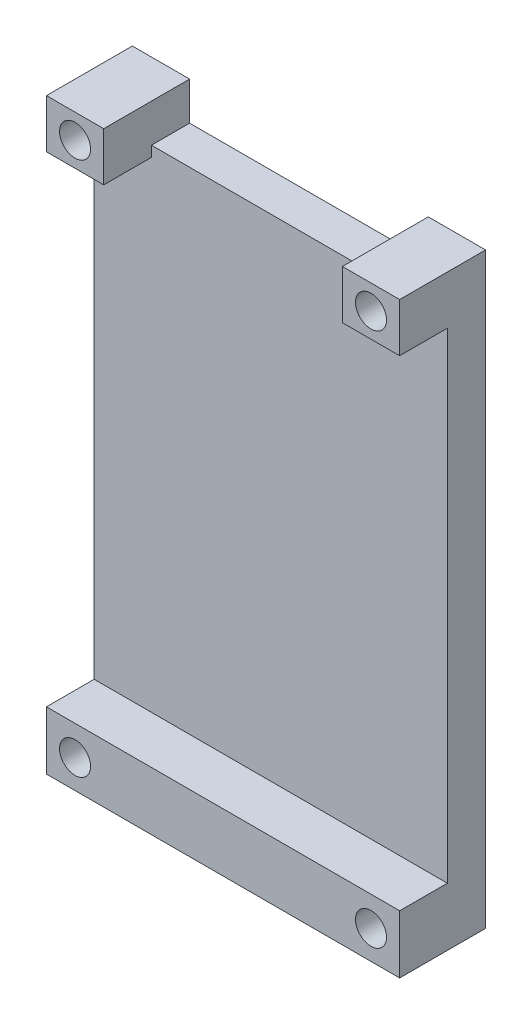
ISO-10303-21;
HEADER;
FILE_DESCRIPTION(('STEP AP214'),'2;1');
FILE_NAME('part.step','',(''),(''),'','','');
FILE_SCHEMA(('AUTOMOTIVE_DESIGN { 1 0 10303 214 1 1 1 1 }'));
ENDSEC;
DATA;
#1=APPLICATION_CONTEXT('core data for automotive mechanical design processes');
#2=APPLICATION_PROTOCOL_DEFINITION('international standard','automotive_design',2000,#1);
#3=PRODUCT_CONTEXT('',#1,'mechanical');
#4=PRODUCT('Part','Part','',(#3));
#5=PRODUCT_RELATED_PRODUCT_CATEGORY('part','',(#4));
#6=PRODUCT_DEFINITION_FORMATION('','',#4);
#7=PRODUCT_DEFINITION_CONTEXT('part definition',#1,'design');
#8=PRODUCT_DEFINITION('design','',#6,#7);
#9=PRODUCT_DEFINITION_SHAPE('','',#8);
#10=(LENGTH_UNIT() NAMED_UNIT(*) SI_UNIT(.MILLI.,.METRE.));
#11=(NAMED_UNIT(*) PLANE_ANGLE_UNIT() SI_UNIT($,.RADIAN.));
#12=(NAMED_UNIT(*) SI_UNIT($,.STERADIAN.) SOLID_ANGLE_UNIT());
#13=UNCERTAINTY_MEASURE_WITH_UNIT(LENGTH_MEASURE(1.E-05),#10,'distance_accuracy_value','');
#14=(GEOMETRIC_REPRESENTATION_CONTEXT(3) GLOBAL_UNCERTAINTY_ASSIGNED_CONTEXT((#13)) GLOBAL_UNIT_ASSIGNED_CONTEXT((#10,
#11,#12)) REPRESENTATION_CONTEXT('',''));
#15=CARTESIAN_POINT('',(0.,0.,0.));
#16=DIRECTION('',(0.,0.,1.));
#17=DIRECTION('',(1.,0.,0.));
#18=AXIS2_PLACEMENT_3D('',#15,#16,#17);
#19=CARTESIAN_POINT('',(0.,0.,8.));
#20=DIRECTION('',(0.,0.,1.));
#21=DIRECTION('',(1.,0.,0.));
#22=AXIS2_PLACEMENT_3D('',#19,#20,#21);
#23=PLANE('',#22);
#24=DIRECTION('',(0.,1.,0.));
#25=VECTOR('',#24,1.);
#26=CARTESIAN_POINT('',(-25.,50.35,8.));
#27=LINE('',#26,#25);
#28=CARTESIAN_POINT('',(-25.,50.35,8.));
#29=VERTEX_POINT('',#28);
#30=CARTESIAN_POINT('',(-25.,52.55,8.));
#31=VERTEX_POINT('',#30);
#32=EDGE_CURVE('E206',#29,#31,#27,.T.);
#33=ORIENTED_EDGE('',*,*,#32,.F.);
#34=DIRECTION('',(1.,0.,0.));
#35=VECTOR('',#34,1.);
#36=CARTESIAN_POINT('',(0.,50.35,8.));
#37=LINE('',#36,#35);
#38=CARTESIAN_POINT('',(-37.,50.35,8.));
#39=VERTEX_POINT('',#38);
#40=EDGE_CURVE('E64',#39,#29,#37,.T.);
#41=ORIENTED_EDGE('',*,*,#40,.F.);
#42=DIRECTION('',(0.,1.,0.));
#43=VECTOR('',#42,1.);
#44=CARTESIAN_POINT('',(-37.,-50.35,8.));
#45=LINE('',#44,#43);
#46=CARTESIAN_POINT('',(-37.,-50.35,8.));
#47=VERTEX_POINT('',#46);
#48=EDGE_CURVE('E218',#47,#39,#45,.T.);
#49=ORIENTED_EDGE('',*,*,#48,.F.);
#50=DIRECTION('',(1.,0.,0.));
#51=VECTOR('',#50,1.);
#52=CARTESIAN_POINT('',(0.,-50.35,8.));
#53=LINE('',#52,#51);
#54=CARTESIAN_POINT('',(37.,-50.3500000000002,8.));
#55=VERTEX_POINT('',#54);
#56=EDGE_CURVE('E278',#47,#55,#53,.T.);
#57=ORIENTED_EDGE('',*,*,#56,.T.);
#58=DIRECTION('',(0.,-1.,0.));
#59=VECTOR('',#58,1.);
#60=CARTESIAN_POINT('',(37.,50.3500000000002,8.));
#61=LINE('',#60,#59);
#62=CARTESIAN_POINT('',(37.,50.3500000000002,8.));
#63=VERTEX_POINT('',#62);
#64=EDGE_CURVE('E267',#63,#55,#61,.T.);
#65=ORIENTED_EDGE('',*,*,#64,.F.);
#66=DIRECTION('',(-1.,0.,0.));
#67=VECTOR('',#66,1.);
#68=CARTESIAN_POINT('',(-2.18358317538581E-13,50.35,8.));
#69=LINE('',#68,#67);
#70=CARTESIAN_POINT('',(25.,50.3500000000001,8.));
#71=VERTEX_POINT('',#70);
#72=EDGE_CURVE('E284',#63,#71,#69,.T.);
#73=ORIENTED_EDGE('',*,*,#72,.T.);
#74=DIRECTION('',(0.,-1.,0.));
#75=VECTOR('',#74,1.);
#76=CARTESIAN_POINT('',(25.,52.55,8.));
#77=LINE('',#76,#75);
#78=CARTESIAN_POINT('',(25.,52.55,8.));
#79=VERTEX_POINT('',#78);
#80=EDGE_CURVE('E241',#79,#71,#77,.T.);
#81=ORIENTED_EDGE('',*,*,#80,.F.);
#82=DIRECTION('',(1.,0.,0.));
#83=VECTOR('',#82,1.);
#84=CARTESIAN_POINT('',(0.,52.55,8.));
#85=LINE('',#84,#83);
#86=EDGE_CURVE('E11',#31,#79,#85,.T.);
#87=ORIENTED_EDGE('',*,*,#86,.F.);
#88=EDGE_LOOP('',(#33,#41,#49,#57,#65,#73,#81,#87));
#89=FACE_BOUND('',#88,.T.);
#90=ADVANCED_FACE('F47',(#89),#23,.T.);
#91=CARTESIAN_POINT('',(0.,52.55,8.));
#92=DIRECTION('',(0.,1.,0.));
#93=DIRECTION('',(-1.,0.,0.));
#94=AXIS2_PLACEMENT_3D('',#91,#92,#93);
#95=PLANE('',#94);
#96=DIRECTION('',(0.,0.,-1.));
#97=VECTOR('',#96,1.);
#98=CARTESIAN_POINT('',(-25.,52.55,8.));
#99=LINE('',#98,#97);
#100=CARTESIAN_POINT('',(-25.,52.55,0.));
#101=VERTEX_POINT('',#100);
#102=EDGE_CURVE('E71',#31,#101,#99,.T.);
#103=ORIENTED_EDGE('',*,*,#102,.F.);
#104=ORIENTED_EDGE('',*,*,#86,.T.);
#105=DIRECTION('',(0.,0.,1.));
#106=VECTOR('',#105,1.);
#107=CARTESIAN_POINT('',(25.,52.55,0.));
#108=LINE('',#107,#106);
#109=CARTESIAN_POINT('',(25.,52.55,0.));
#110=VERTEX_POINT('',#109);
#111=EDGE_CURVE('E237',#110,#79,#108,.T.);
#112=ORIENTED_EDGE('',*,*,#111,.F.);
#113=DIRECTION('',(1.,0.,0.));
#114=VECTOR('',#113,1.);
#115=CARTESIAN_POINT('',(0.,52.55,0.));
#116=LINE('',#115,#114);
#117=EDGE_CURVE('E315',#101,#110,#116,.T.);
#118=ORIENTED_EDGE('',*,*,#117,.F.);
#119=EDGE_LOOP('',(#103,#104,#112,#118));
#120=FACE_BOUND('',#119,.T.);
#121=ADVANCED_FACE('F49',(#120),#95,.T.);
#122=CARTESIAN_POINT('',(0.,60.55,8.));
#123=DIRECTION('',(0.,1.,0.));
#124=DIRECTION('',(-1.,0.,0.));
#125=AXIS2_PLACEMENT_3D('',#122,#123,#124);
#126=PLANE('',#125);
#127=DIRECTION('',(1.,0.,0.));
#128=VECTOR('',#127,1.);
#129=CARTESIAN_POINT('',(0.,60.55,0.));
#130=LINE('',#129,#128);
#131=CARTESIAN_POINT('',(-37.,60.55,0.));
#132=VERTEX_POINT('',#131);
#133=CARTESIAN_POINT('',(-25.,60.55,0.));
#134=VERTEX_POINT('',#133);
#135=EDGE_CURVE('E320',#132,#134,#130,.T.);
#136=ORIENTED_EDGE('',*,*,#135,.F.);
#137=DIRECTION('',(0.,0.,-1.));
#138=VECTOR('',#137,1.);
#139=CARTESIAN_POINT('',(-37.,60.55,18.));
#140=LINE('',#139,#138);
#141=CARTESIAN_POINT('',(-37.,60.55,18.));
#142=VERTEX_POINT('',#141);
#143=EDGE_CURVE('E159',#142,#132,#140,.T.);
#144=ORIENTED_EDGE('',*,*,#143,.F.);
#145=DIRECTION('',(-1.,0.,0.));
#146=VECTOR('',#145,1.);
#147=CARTESIAN_POINT('',(0.,60.55,18.));
#148=LINE('',#147,#146);
#149=CARTESIAN_POINT('',(-25.,60.55,18.));
#150=VERTEX_POINT('',#149);
#151=EDGE_CURVE('E305',#150,#142,#148,.T.);
#152=ORIENTED_EDGE('',*,*,#151,.F.);
#153=DIRECTION('',(0.,0.,1.));
#154=VECTOR('',#153,1.);
#155=CARTESIAN_POINT('',(-25.,60.55,0.));
#156=LINE('',#155,#154);
#157=EDGE_CURVE('E194',#134,#150,#156,.T.);
#158=ORIENTED_EDGE('',*,*,#157,.F.);
#159=EDGE_LOOP('',(#136,#144,#152,#158));
#160=FACE_BOUND('',#159,.T.);
#161=ADVANCED_FACE('F371',(#160),#126,.T.);
#162=CARTESIAN_POINT('',(0.,60.55,8.));
#163=DIRECTION('',(0.,-1.,0.));
#164=DIRECTION('',(0.,0.,-1.));
#165=AXIS2_PLACEMENT_3D('',#162,#163,#164);
#166=PLANE('',#165);
#167=DIRECTION('',(-1.,0.,0.));
#168=VECTOR('',#167,1.);
#169=CARTESIAN_POINT('',(0.,60.55,0.));
#170=LINE('',#169,#168);
#171=CARTESIAN_POINT('',(37.,60.55,0.));
#172=VERTEX_POINT('',#171);
#173=CARTESIAN_POINT('',(25.,60.55,0.));
#174=VERTEX_POINT('',#173);
#175=EDGE_CURVE('E323',#172,#174,#170,.T.);
#176=ORIENTED_EDGE('',*,*,#175,.T.);
#177=DIRECTION('',(0.,0.,-1.));
#178=VECTOR('',#177,1.);
#179=CARTESIAN_POINT('',(25.,60.55,18.));
#180=LINE('',#179,#178);
#181=CARTESIAN_POINT('',(25.,60.55,18.));
#182=VERTEX_POINT('',#181);
#183=EDGE_CURVE('E229',#182,#174,#180,.T.);
#184=ORIENTED_EDGE('',*,*,#183,.F.);
#185=DIRECTION('',(-1.,0.,0.));
#186=VECTOR('',#185,1.);
#187=CARTESIAN_POINT('',(0.,60.55,18.));
#188=LINE('',#187,#186);
#189=CARTESIAN_POINT('',(37.,60.55,18.));
#190=VERTEX_POINT('',#189);
#191=EDGE_CURVE('E287',#190,#182,#188,.T.);
#192=ORIENTED_EDGE('',*,*,#191,.F.);
#193=DIRECTION('',(0.,0.,1.));
#194=VECTOR('',#193,1.);
#195=CARTESIAN_POINT('',(37.,60.55,0.));
#196=LINE('',#195,#194);
#197=EDGE_CURVE('E255',#172,#190,#196,.T.);
#198=ORIENTED_EDGE('',*,*,#197,.F.);
#199=EDGE_LOOP('',(#176,#184,#192,#198));
#200=FACE_BOUND('',#199,.T.);
#201=ADVANCED_FACE('F362',(#200),#166,.F.);
#202=CARTESIAN_POINT('',(31.,-56.55,8.));
#203=DIRECTION('',(0.,0.,-1.));
#204=DIRECTION('',(-1.,0.,0.));
#205=AXIS2_PLACEMENT_3D('',#202,#203,#204);
#206=CYLINDRICAL_SURFACE('',#205,3.25);
#207=CARTESIAN_POINT('',(31.,-56.55,0.));
#208=DIRECTION('',(0.,0.,1.));
#209=DIRECTION('',(1.,0.,0.));
#210=AXIS2_PLACEMENT_3D('',#207,#208,#209);
#211=CIRCLE('',#210,3.25);
#212=CARTESIAN_POINT('',(34.25,-56.55,0.));
#213=VERTEX_POINT('',#212);
#214=EDGE_CURVE('E333',#213,#213,#211,.T.);
#215=ORIENTED_EDGE('',*,*,#214,.F.);
#216=EDGE_LOOP('',(#215));
#217=FACE_BOUND('',#216,.T.);
#218=CARTESIAN_POINT('',(31.,-56.55,18.));
#219=DIRECTION('',(0.,0.,1.));
#220=DIRECTION('',(1.,0.,0.));
#221=AXIS2_PLACEMENT_3D('',#218,#219,#220);
#222=CIRCLE('',#221,3.25);
#223=CARTESIAN_POINT('',(34.25,-56.55,18.));
#224=VERTEX_POINT('',#223);
#225=EDGE_CURVE('E292',#224,#224,#222,.F.);
#226=ORIENTED_EDGE('',*,*,#225,.F.);
#227=EDGE_LOOP('',(#226));
#228=FACE_BOUND('',#227,.T.);
#229=ADVANCED_FACE('F359',(#217,#228),#206,.F.);
#230=CARTESIAN_POINT('',(-31.,55.45,8.));
#231=DIRECTION('',(0.,0.,-1.));
#232=DIRECTION('',(-1.,0.,0.));
#233=AXIS2_PLACEMENT_3D('',#230,#231,#232);
#234=CYLINDRICAL_SURFACE('',#233,3.25000000000001);
#235=CARTESIAN_POINT('',(-31.,55.45,0.));
#236=DIRECTION('',(0.,0.,1.));
#237=DIRECTION('',(1.,0.,0.));
#238=AXIS2_PLACEMENT_3D('',#235,#236,#237);
#239=CIRCLE('',#238,3.25000000000001);
#240=CARTESIAN_POINT('',(-27.75,55.45,0.));
#241=VERTEX_POINT('',#240);
#242=EDGE_CURVE('E330',#241,#241,#239,.T.);
#243=ORIENTED_EDGE('',*,*,#242,.F.);
#244=EDGE_LOOP('',(#243));
#245=FACE_BOUND('',#244,.T.);
#246=CARTESIAN_POINT('',(-31.,55.45,18.));
#247=DIRECTION('',(0.,0.,1.));
#248=DIRECTION('',(1.,0.,0.));
#249=AXIS2_PLACEMENT_3D('',#246,#247,#248);
#250=CIRCLE('',#249,3.25000000000001);
#251=CARTESIAN_POINT('',(-27.75,55.45,18.));
#252=VERTEX_POINT('',#251);
#253=EDGE_CURVE('E311',#252,#252,#250,.F.);
#254=ORIENTED_EDGE('',*,*,#253,.F.);
#255=EDGE_LOOP('',(#254));
#256=FACE_BOUND('',#255,.T.);
#257=ADVANCED_FACE('F361',(#245,#256),#234,.F.);
#258=CARTESIAN_POINT('',(31.,55.45,8.));
#259=DIRECTION('',(0.,0.,-1.));
#260=DIRECTION('',(-1.,0.,0.));
#261=AXIS2_PLACEMENT_3D('',#258,#259,#260);
#262=CYLINDRICAL_SURFACE('',#261,3.25);
#263=CARTESIAN_POINT('',(31.,55.45,0.));
#264=DIRECTION('',(0.,0.,1.));
#265=DIRECTION('',(1.,0.,0.));
#266=AXIS2_PLACEMENT_3D('',#263,#264,#265);
#267=CIRCLE('',#266,3.25);
#268=CARTESIAN_POINT('',(34.25,55.45,0.));
#269=VERTEX_POINT('',#268);
#270=EDGE_CURVE('E326',#269,#269,#267,.T.);
#271=ORIENTED_EDGE('',*,*,#270,.F.);
#272=EDGE_LOOP('',(#271));
#273=FACE_BOUND('',#272,.T.);
#274=CARTESIAN_POINT('',(31.,55.45,18.));
#275=DIRECTION('',(0.,0.,1.));
#276=DIRECTION('',(1.,0.,0.));
#277=AXIS2_PLACEMENT_3D('',#274,#275,#276);
#278=CIRCLE('',#277,3.25);
#279=CARTESIAN_POINT('',(34.25,55.45,18.));
#280=VERTEX_POINT('',#279);
#281=EDGE_CURVE('E279',#280,#280,#278,.F.);
#282=ORIENTED_EDGE('',*,*,#281,.F.);
#283=EDGE_LOOP('',(#282));
#284=FACE_BOUND('',#283,.T.);
#285=ADVANCED_FACE('F346',(#273,#284),#262,.F.);
#286=CARTESIAN_POINT('',(-31.,-56.55,8.));
#287=DIRECTION('',(0.,0.,-1.));
#288=DIRECTION('',(-1.,0.,0.));
#289=AXIS2_PLACEMENT_3D('',#286,#287,#288);
#290=CYLINDRICAL_SURFACE('',#289,3.25000000000001);
#291=CARTESIAN_POINT('',(-31.,-56.55,0.));
#292=DIRECTION('',(0.,0.,1.));
#293=DIRECTION('',(1.,0.,0.));
#294=AXIS2_PLACEMENT_3D('',#291,#292,#293);
#295=CIRCLE('',#294,3.25000000000001);
#296=CARTESIAN_POINT('',(-27.75,-56.55,0.));
#297=VERTEX_POINT('',#296);
#298=EDGE_CURVE('E51',#297,#297,#295,.T.);
#299=ORIENTED_EDGE('',*,*,#298,.F.);
#300=EDGE_LOOP('',(#299));
#301=FACE_BOUND('',#300,.T.);
#302=CARTESIAN_POINT('',(-31.,-56.55,18.));
#303=DIRECTION('',(0.,0.,1.));
#304=DIRECTION('',(1.,0.,0.));
#305=AXIS2_PLACEMENT_3D('',#302,#303,#304);
#306=CIRCLE('',#305,3.25000000000001);
#307=CARTESIAN_POINT('',(-27.75,-56.55,18.));
#308=VERTEX_POINT('',#307);
#309=EDGE_CURVE('E297',#308,#308,#306,.F.);
#310=ORIENTED_EDGE('',*,*,#309,.F.);
#311=EDGE_LOOP('',(#310));
#312=FACE_BOUND('',#311,.T.);
#313=ADVANCED_FACE('F343',(#301,#312),#290,.F.);
#314=CARTESIAN_POINT('',(0.,0.,0.));
#315=DIRECTION('',(0.,0.,1.));
#316=DIRECTION('',(1.,0.,0.));
#317=AXIS2_PLACEMENT_3D('',#314,#315,#316);
#318=PLANE('',#317);
#319=DIRECTION('',(0.,1.,0.));
#320=VECTOR('',#319,1.);
#321=CARTESIAN_POINT('',(-25.,52.55,0.));
#322=LINE('',#321,#320);
#323=EDGE_CURVE('E190',#101,#134,#322,.T.);
#324=ORIENTED_EDGE('',*,*,#323,.F.);
#325=ORIENTED_EDGE('',*,*,#117,.T.);
#326=DIRECTION('',(0.,-1.,0.));
#327=VECTOR('',#326,1.);
#328=CARTESIAN_POINT('',(25.,60.55,0.));
#329=LINE('',#328,#327);
#330=EDGE_CURVE('E233',#174,#110,#329,.T.);
#331=ORIENTED_EDGE('',*,*,#330,.F.);
#332=ORIENTED_EDGE('',*,*,#175,.F.);
#333=DIRECTION('',(0.,1.,0.));
#334=VECTOR('',#333,1.);
#335=CARTESIAN_POINT('',(37.,-60.55,0.));
#336=LINE('',#335,#334);
#337=CARTESIAN_POINT('',(37.,-62.55,0.));
#338=VERTEX_POINT('',#337);
#339=EDGE_CURVE('E170',#338,#172,#336,.T.);
#340=ORIENTED_EDGE('',*,*,#339,.F.);
#341=DIRECTION('',(1.,0.,0.));
#342=VECTOR('',#341,1.);
#343=CARTESIAN_POINT('',(-37.,-62.55,0.));
#344=LINE('',#343,#342);
#345=CARTESIAN_POINT('',(-37.,-62.55,0.));
#346=VERTEX_POINT('',#345);
#347=EDGE_CURVE('E165',#346,#338,#344,.T.);
#348=ORIENTED_EDGE('',*,*,#347,.F.);
#349=DIRECTION('',(0.,-1.,0.));
#350=VECTOR('',#349,1.);
#351=CARTESIAN_POINT('',(-37.,60.55,0.));
#352=LINE('',#351,#350);
#353=EDGE_CURVE('E151',#132,#346,#352,.T.);
#354=ORIENTED_EDGE('',*,*,#353,.F.);
#355=ORIENTED_EDGE('',*,*,#135,.T.);
#356=EDGE_LOOP('',(#324,#325,#331,#332,#340,#348,#354,#355));
#357=FACE_BOUND('',#356,.T.);
#358=ORIENTED_EDGE('',*,*,#270,.T.);
#359=EDGE_LOOP('',(#358));
#360=FACE_BOUND('',#359,.T.);
#361=ORIENTED_EDGE('',*,*,#242,.T.);
#362=EDGE_LOOP('',(#361));
#363=FACE_BOUND('',#362,.T.);
#364=ORIENTED_EDGE('',*,*,#214,.T.);
#365=EDGE_LOOP('',(#364));
#366=FACE_BOUND('',#365,.T.);
#367=ORIENTED_EDGE('',*,*,#298,.T.);
#368=EDGE_LOOP('',(#367));
#369=FACE_BOUND('',#368,.T.);
#370=ADVANCED_FACE('F167',(#357,#360,#363,#366,#369),#318,.F.);
#371=CARTESIAN_POINT('',(0.,50.35,18.));
#372=DIRECTION('',(0.,1.,0.));
#373=DIRECTION('',(0.,0.,1.));
#374=AXIS2_PLACEMENT_3D('',#371,#372,#373);
#375=PLANE('',#374);
#376=ORIENTED_EDGE('',*,*,#40,.T.);
#377=DIRECTION('',(0.,0.,-1.));
#378=VECTOR('',#377,1.);
#379=CARTESIAN_POINT('',(-25.,50.35,18.));
#380=LINE('',#379,#378);
#381=CARTESIAN_POINT('',(-25.,50.35,18.));
#382=VERTEX_POINT('',#381);
#383=EDGE_CURVE('E202',#382,#29,#380,.T.);
#384=ORIENTED_EDGE('',*,*,#383,.F.);
#385=DIRECTION('',(1.,0.,0.));
#386=VECTOR('',#385,1.);
#387=CARTESIAN_POINT('',(0.,50.35,18.));
#388=LINE('',#387,#386);
#389=CARTESIAN_POINT('',(-37.,50.35,18.));
#390=VERTEX_POINT('',#389);
#391=EDGE_CURVE('E308',#390,#382,#388,.T.);
#392=ORIENTED_EDGE('',*,*,#391,.F.);
#393=DIRECTION('',(0.,0.,1.));
#394=VECTOR('',#393,1.);
#395=CARTESIAN_POINT('',(-37.,50.35,8.));
#396=LINE('',#395,#394);
#397=EDGE_CURVE('E222',#39,#390,#396,.T.);
#398=ORIENTED_EDGE('',*,*,#397,.F.);
#399=EDGE_LOOP('',(#376,#384,#392,#398));
#400=FACE_BOUND('',#399,.T.);
#401=ADVANCED_FACE('F383',(#400),#375,.F.);
#402=CARTESIAN_POINT('',(0.,0.,18.));
#403=DIRECTION('',(0.,0.,1.));
#404=DIRECTION('',(1.,0.,0.));
#405=AXIS2_PLACEMENT_3D('',#402,#403,#404);
#406=PLANE('',#405);
#407=ORIENTED_EDGE('',*,*,#391,.T.);
#408=DIRECTION('',(0.,-1.,0.));
#409=VECTOR('',#408,1.);
#410=CARTESIAN_POINT('',(-25.,60.55,18.));
#411=LINE('',#410,#409);
#412=EDGE_CURVE('E198',#150,#382,#411,.T.);
#413=ORIENTED_EDGE('',*,*,#412,.F.);
#414=ORIENTED_EDGE('',*,*,#151,.T.);
#415=DIRECTION('',(0.,1.,0.));
#416=VECTOR('',#415,1.);
#417=CARTESIAN_POINT('',(-37.,50.35,18.));
#418=LINE('',#417,#416);
#419=EDGE_CURVE('E226',#390,#142,#418,.T.);
#420=ORIENTED_EDGE('',*,*,#419,.F.);
#421=EDGE_LOOP('',(#407,#413,#414,#420));
#422=FACE_BOUND('',#421,.T.);
#423=ORIENTED_EDGE('',*,*,#253,.T.);
#424=EDGE_LOOP('',(#423));
#425=FACE_BOUND('',#424,.T.);
#426=ADVANCED_FACE('F390',(#422,#425),#406,.T.);
#427=CARTESIAN_POINT('',(-2.18358317538581E-13,50.35,18.));
#428=DIRECTION('',(0.,-1.,0.));
#429=DIRECTION('',(1.,0.,0.));
#430=AXIS2_PLACEMENT_3D('',#427,#428,#429);
#431=PLANE('',#430);
#432=ORIENTED_EDGE('',*,*,#72,.F.);
#433=DIRECTION('',(0.,0.,-1.));
#434=VECTOR('',#433,1.);
#435=CARTESIAN_POINT('',(37.,50.3500000000002,18.));
#436=LINE('',#435,#434);
#437=CARTESIAN_POINT('',(37.,50.3500000000002,18.));
#438=VERTEX_POINT('',#437);
#439=EDGE_CURVE('E263',#438,#63,#436,.T.);
#440=ORIENTED_EDGE('',*,*,#439,.F.);
#441=DIRECTION('',(-1.,0.,0.));
#442=VECTOR('',#441,1.);
#443=CARTESIAN_POINT('',(-2.18358317538581E-13,50.35,18.));
#444=LINE('',#443,#442);
#445=CARTESIAN_POINT('',(25.,50.3500000000001,18.));
#446=VERTEX_POINT('',#445);
#447=EDGE_CURVE('E283',#438,#446,#444,.T.);
#448=ORIENTED_EDGE('',*,*,#447,.T.);
#449=DIRECTION('',(0.,0.,1.));
#450=VECTOR('',#449,1.);
#451=CARTESIAN_POINT('',(25.,50.3500000000001,8.));
#452=LINE('',#451,#450);
#453=EDGE_CURVE('E245',#71,#446,#452,.T.);
#454=ORIENTED_EDGE('',*,*,#453,.F.);
#455=EDGE_LOOP('',(#432,#440,#448,#454));
#456=FACE_BOUND('',#455,.T.);
#457=ADVANCED_FACE('F395',(#456),#431,.T.);
#458=CARTESIAN_POINT('',(0.,0.,18.));
#459=DIRECTION('',(0.,0.,1.));
#460=DIRECTION('',(1.,0.,0.));
#461=AXIS2_PLACEMENT_3D('',#458,#459,#460);
#462=PLANE('',#461);
#463=ORIENTED_EDGE('',*,*,#281,.T.);
#464=EDGE_LOOP('',(#463));
#465=FACE_BOUND('',#464,.T.);
#466=ORIENTED_EDGE('',*,*,#191,.T.);
#467=DIRECTION('',(0.,1.,0.));
#468=VECTOR('',#467,1.);
#469=CARTESIAN_POINT('',(25.,50.3500000000001,18.));
#470=LINE('',#469,#468);
#471=EDGE_CURVE('E249',#446,#182,#470,.T.);
#472=ORIENTED_EDGE('',*,*,#471,.F.);
#473=ORIENTED_EDGE('',*,*,#447,.F.);
#474=DIRECTION('',(0.,-1.,0.));
#475=VECTOR('',#474,1.);
#476=CARTESIAN_POINT('',(37.,60.55,18.));
#477=LINE('',#476,#475);
#478=EDGE_CURVE('E259',#190,#438,#477,.T.);
#479=ORIENTED_EDGE('',*,*,#478,.F.);
#480=EDGE_LOOP('',(#466,#472,#473,#479));
#481=FACE_BOUND('',#480,.T.);
#482=ADVANCED_FACE('F400',(#465,#481),#462,.T.);
#483=CARTESIAN_POINT('',(0.,-50.35,18.));
#484=DIRECTION('',(0.,1.,0.));
#485=DIRECTION('',(0.,0.,1.));
#486=AXIS2_PLACEMENT_3D('',#483,#484,#485);
#487=PLANE('',#486);
#488=ORIENTED_EDGE('',*,*,#56,.F.);
#489=DIRECTION('',(0.,0.,-1.));
#490=VECTOR('',#489,1.);
#491=CARTESIAN_POINT('',(-37.,-50.35,18.));
#492=LINE('',#491,#490);
#493=CARTESIAN_POINT('',(-37.,-50.35,18.));
#494=VERTEX_POINT('',#493);
#495=EDGE_CURVE('E214',#494,#47,#492,.T.);
#496=ORIENTED_EDGE('',*,*,#495,.F.);
#497=DIRECTION('',(1.,0.,0.));
#498=VECTOR('',#497,1.);
#499=CARTESIAN_POINT('',(0.,-50.35,18.));
#500=LINE('',#499,#498);
#501=CARTESIAN_POINT('',(37.,-50.3500000000002,18.));
#502=VERTEX_POINT('',#501);
#503=EDGE_CURVE('E296',#494,#502,#500,.T.);
#504=ORIENTED_EDGE('',*,*,#503,.T.);
#505=DIRECTION('',(0.,0.,1.));
#506=VECTOR('',#505,1.);
#507=CARTESIAN_POINT('',(37.,-50.3500000000002,8.));
#508=LINE('',#507,#506);
#509=EDGE_CURVE('E271',#55,#502,#508,.T.);
#510=ORIENTED_EDGE('',*,*,#509,.F.);
#511=EDGE_LOOP('',(#488,#496,#504,#510));
#512=FACE_BOUND('',#511,.T.);
#513=ADVANCED_FACE('F354',(#512),#487,.T.);
#514=CARTESIAN_POINT('',(0.,0.,18.));
#515=DIRECTION('',(0.,0.,1.));
#516=DIRECTION('',(1.,0.,0.));
#517=AXIS2_PLACEMENT_3D('',#514,#515,#516);
#518=PLANE('',#517);
#519=ORIENTED_EDGE('',*,*,#309,.T.);
#520=EDGE_LOOP('',(#519));
#521=FACE_BOUND('',#520,.T.);
#522=DIRECTION('',(0.,1.,0.));
#523=VECTOR('',#522,1.);
#524=CARTESIAN_POINT('',(-37.,-60.55,18.));
#525=LINE('',#524,#523);
#526=CARTESIAN_POINT('',(-37.,-62.55,18.));
#527=VERTEX_POINT('',#526);
#528=EDGE_CURVE('E162',#527,#494,#525,.T.);
#529=ORIENTED_EDGE('',*,*,#528,.F.);
#530=DIRECTION('',(-1.,0.,0.));
#531=VECTOR('',#530,1.);
#532=CARTESIAN_POINT('',(37.,-62.55,18.));
#533=LINE('',#532,#531);
#534=CARTESIAN_POINT('',(37.,-62.55,18.));
#535=VERTEX_POINT('',#534);
#536=EDGE_CURVE('E180',#535,#527,#533,.T.);
#537=ORIENTED_EDGE('',*,*,#536,.F.);
#538=DIRECTION('',(0.,-1.,0.));
#539=VECTOR('',#538,1.);
#540=CARTESIAN_POINT('',(37.,-50.3500000000002,18.));
#541=LINE('',#540,#539);
#542=EDGE_CURVE('E275',#502,#535,#541,.T.);
#543=ORIENTED_EDGE('',*,*,#542,.F.);
#544=ORIENTED_EDGE('',*,*,#503,.F.);
#545=EDGE_LOOP('',(#529,#537,#543,#544));
#546=FACE_BOUND('',#545,.T.);
#547=ORIENTED_EDGE('',*,*,#225,.T.);
#548=EDGE_LOOP('',(#547));
#549=FACE_BOUND('',#548,.T.);
#550=ADVANCED_FACE('F350',(#521,#546,#549),#518,.T.);
#551=CARTESIAN_POINT('',(37.,0.,0.));
#552=DIRECTION('',(1.,0.,0.));
#553=DIRECTION('',(0.,1.,0.));
#554=AXIS2_PLACEMENT_3D('',#551,#552,#553);
#555=PLANE('',#554);
#556=ORIENTED_EDGE('',*,*,#542,.T.);
#557=DIRECTION('',(0.,0.,1.));
#558=VECTOR('',#557,1.);
#559=CARTESIAN_POINT('',(37.,-62.55,0.));
#560=LINE('',#559,#558);
#561=EDGE_CURVE('E175',#338,#535,#560,.T.);
#562=ORIENTED_EDGE('',*,*,#561,.F.);
#563=ORIENTED_EDGE('',*,*,#339,.T.);
#564=ORIENTED_EDGE('',*,*,#197,.T.);
#565=ORIENTED_EDGE('',*,*,#478,.T.);
#566=ORIENTED_EDGE('',*,*,#439,.T.);
#567=ORIENTED_EDGE('',*,*,#64,.T.);
#568=ORIENTED_EDGE('',*,*,#509,.T.);
#569=EDGE_LOOP('',(#556,#562,#563,#564,#565,#566,#567,#568));
#570=FACE_BOUND('',#569,.T.);
#571=ADVANCED_FACE('F353',(#570),#555,.T.);
#572=CARTESIAN_POINT('',(25.,0.,0.));
#573=DIRECTION('',(-1.,0.,0.));
#574=DIRECTION('',(0.,0.,1.));
#575=AXIS2_PLACEMENT_3D('',#572,#573,#574);
#576=PLANE('',#575);
#577=ORIENTED_EDGE('',*,*,#183,.T.);
#578=ORIENTED_EDGE('',*,*,#330,.T.);
#579=ORIENTED_EDGE('',*,*,#111,.T.);
#580=ORIENTED_EDGE('',*,*,#80,.T.);
#581=ORIENTED_EDGE('',*,*,#453,.T.);
#582=ORIENTED_EDGE('',*,*,#471,.T.);
#583=EDGE_LOOP('',(#577,#578,#579,#580,#581,#582));
#584=FACE_BOUND('',#583,.T.);
#585=ADVANCED_FACE('F412',(#584),#576,.T.);
#586=CARTESIAN_POINT('',(-37.,0.,0.));
#587=DIRECTION('',(-1.,0.,0.));
#588=DIRECTION('',(0.,-1.,0.));
#589=AXIS2_PLACEMENT_3D('',#586,#587,#588);
#590=PLANE('',#589);
#591=ORIENTED_EDGE('',*,*,#143,.T.);
#592=ORIENTED_EDGE('',*,*,#353,.T.);
#593=DIRECTION('',(0.,0.,-1.));
#594=VECTOR('',#593,1.);
#595=CARTESIAN_POINT('',(-37.,-62.55,18.));
#596=LINE('',#595,#594);
#597=EDGE_CURVE('E156',#527,#346,#596,.T.);
#598=ORIENTED_EDGE('',*,*,#597,.F.);
#599=ORIENTED_EDGE('',*,*,#528,.T.);
#600=ORIENTED_EDGE('',*,*,#495,.T.);
#601=ORIENTED_EDGE('',*,*,#48,.T.);
#602=ORIENTED_EDGE('',*,*,#397,.T.);
#603=ORIENTED_EDGE('',*,*,#419,.T.);
#604=EDGE_LOOP('',(#591,#592,#598,#599,#600,#601,#602,#603));
#605=FACE_BOUND('',#604,.T.);
#606=ADVANCED_FACE('F153',(#605),#590,.T.);
#607=CARTESIAN_POINT('',(-25.,0.,0.));
#608=DIRECTION('',(1.,0.,0.));
#609=DIRECTION('',(0.,0.,-1.));
#610=AXIS2_PLACEMENT_3D('',#607,#608,#609);
#611=PLANE('',#610);
#612=ORIENTED_EDGE('',*,*,#102,.T.);
#613=ORIENTED_EDGE('',*,*,#323,.T.);
#614=ORIENTED_EDGE('',*,*,#157,.T.);
#615=ORIENTED_EDGE('',*,*,#412,.T.);
#616=ORIENTED_EDGE('',*,*,#383,.T.);
#617=ORIENTED_EDGE('',*,*,#32,.T.);
#618=EDGE_LOOP('',(#612,#613,#614,#615,#616,#617));
#619=FACE_BOUND('',#618,.T.);
#620=ADVANCED_FACE('F419',(#619),#611,.T.);
#621=CARTESIAN_POINT('',(0.,-62.55,0.));
#622=DIRECTION('',(0.,-1.,0.));
#623=DIRECTION('',(0.,0.,-1.));
#624=AXIS2_PLACEMENT_3D('',#621,#622,#623);
#625=PLANE('',#624);
#626=ORIENTED_EDGE('',*,*,#597,.T.);
#627=ORIENTED_EDGE('',*,*,#347,.T.);
#628=ORIENTED_EDGE('',*,*,#561,.T.);
#629=ORIENTED_EDGE('',*,*,#536,.T.);
#630=EDGE_LOOP('',(#626,#627,#628,#629));
#631=FACE_BOUND('',#630,.T.);
#632=ADVANCED_FACE('F178',(#631),#625,.T.);
#633=CLOSED_SHELL('',(#90,#121,#161,#201,#229,#257,#285,#313,#370,#401,#426,#457,#482,#513,#550,
#571,#585,#606,#620,#632));
#634=MANIFOLD_SOLID_BREP('B2',#633);
#635=ADVANCED_BREP_SHAPE_REPRESENTATION('',(#18,#634),#14);
#636=SHAPE_DEFINITION_REPRESENTATION(#9,#635);
ENDSEC;
END-ISO-10303-21;
